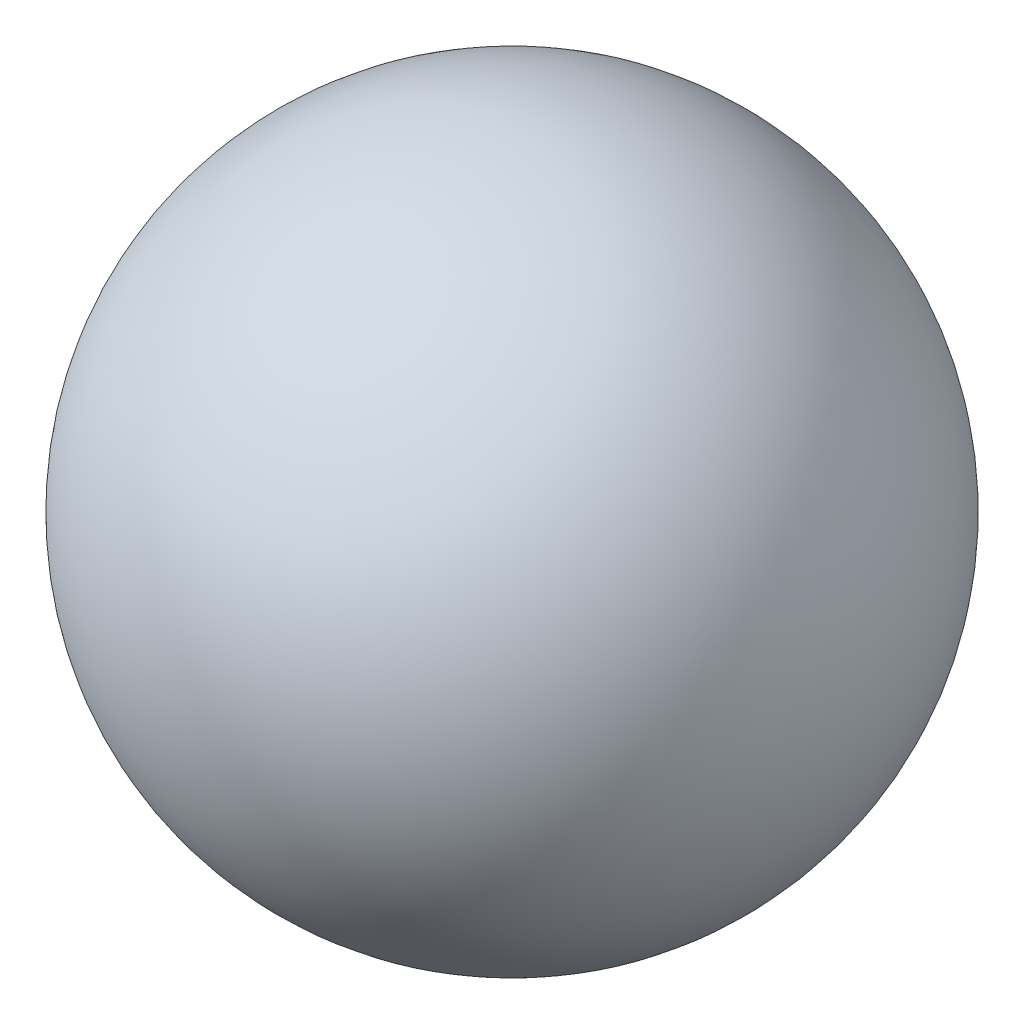
ISO-10303-21;
HEADER;
FILE_DESCRIPTION(('STEP AP214'),'2;1');
FILE_NAME('part.step','',(''),(''),'','','');
FILE_SCHEMA(('AUTOMOTIVE_DESIGN { 1 0 10303 214 1 1 1 1 }'));
ENDSEC;
DATA;
#1=APPLICATION_CONTEXT('core data for automotive mechanical design processes');
#2=APPLICATION_PROTOCOL_DEFINITION('international standard','automotive_design',2000,#1);
#3=PRODUCT_CONTEXT('',#1,'mechanical');
#4=PRODUCT('Part','Part','',(#3));
#5=PRODUCT_RELATED_PRODUCT_CATEGORY('part','',(#4));
#6=PRODUCT_DEFINITION_FORMATION('','',#4);
#7=PRODUCT_DEFINITION_CONTEXT('part definition',#1,'design');
#8=PRODUCT_DEFINITION('design','',#6,#7);
#9=PRODUCT_DEFINITION_SHAPE('','',#8);
#10=(LENGTH_UNIT() NAMED_UNIT(*) SI_UNIT(.MILLI.,.METRE.));
#11=(NAMED_UNIT(*) PLANE_ANGLE_UNIT() SI_UNIT($,.RADIAN.));
#12=(NAMED_UNIT(*) SI_UNIT($,.STERADIAN.) SOLID_ANGLE_UNIT());
#13=UNCERTAINTY_MEASURE_WITH_UNIT(LENGTH_MEASURE(1.E-05),#10,'distance_accuracy_value','');
#14=(GEOMETRIC_REPRESENTATION_CONTEXT(3) GLOBAL_UNCERTAINTY_ASSIGNED_CONTEXT((#13)) GLOBAL_UNIT_ASSIGNED_CONTEXT((#10,
#11,#12)) REPRESENTATION_CONTEXT('',''));
#15=CARTESIAN_POINT('',(0.,0.,0.));
#16=DIRECTION('',(0.,0.,1.));
#17=DIRECTION('',(1.,0.,0.));
#18=AXIS2_PLACEMENT_3D('',#15,#16,#17);
#19=CARTESIAN_POINT('',(-300.,600.,0.));
#20=DIRECTION('',(0.,1.,0.));
#21=DIRECTION('',(-1.,0.,0.));
#22=AXIS2_PLACEMENT_3D('',#19,#20,#21);
#23=SPHERICAL_SURFACE('',#22,1550.36756758);
#24=CARTESIAN_POINT('',(-300.,-805.110199276447,0.));
#25=DIRECTION('',(0.,1.,0.));
#26=DIRECTION('',(-1.,0.,0.));
#27=AXIS2_PLACEMENT_3D('',#24,#25,#26);
#28=CIRCLE('',#27,655.213646449177);
#29=CARTESIAN_POINT('',(-955.213646449177,-805.110199276447,0.));
#30=VERTEX_POINT('',#29);
#31=EDGE_CURVE('E39',#30,#30,#28,.T.);
#32=ORIENTED_EDGE('',*,*,#31,.T.);
#33=EDGE_LOOP('',(#32));
#34=FACE_BOUND('',#33,.T.);
#35=ADVANCED_FACE('F18',(#34),#23,.T.);
#36=CARTESIAN_POINT('',(-595.832783209171,-34.4154509300002,0.));
#37=DIRECTION('',(0.,0.,-1.));
#38=DIRECTION('',(-1.,0.,0.));
#39=AXIS2_PLACEMENT_3D('',#36,#37,#38);
#40=CIRCLE('',#39,850.36756758);
#41=TRIMMED_CURVE('',#40,(PARAMETER_VALUE(-1.92611391201244)),
(PARAMETER_VALUE(1.92611391201244)),.T.,.PARAMETER.);
#42=CARTESIAN_POINT('',(-300.,-34.4154509300001,0.));
#43=DIRECTION('',(0.,1.,0.));
#44=AXIS1_PLACEMENT('',#42,#43);
#45=SURFACE_OF_REVOLUTION('',#41,#44);
#46=CARTESIAN_POINT('',(-300.,-831.665702965483,0.));
#47=VERTEX_POINT('',#46);
#48=VERTEX_LOOP('',#47);
#49=FACE_BOUND('',#48,.T.);
#50=ORIENTED_EDGE('',*,*,#31,.F.);
#51=EDGE_LOOP('',(#50));
#52=FACE_BOUND('',#51,.T.);
#53=ADVANCED_FACE('F33',(#49,#52),#45,.T.);
#54=CLOSED_SHELL('',(#35,#53));
#55=CARTESIAN_POINT('',(56.50784603,143.782535,0.));
#56=DIRECTION('',(0.,0.,-1.));
#57=DIRECTION('',(-1.,0.,0.));
#58=AXIS2_PLACEMENT_3D('',#55,#56,#57);
#59=CIRCLE('',#58,580.6534894);
#60=TRIMMED_CURVE('',#59,(PARAMETER_VALUE(-0.909707150875269)),
(PARAMETER_VALUE(0.909707150875269)),.T.,.PARAMETER.);
#61=CARTESIAN_POINT('',(-300.,143.782535,0.));
#62=DIRECTION('',(0.,1.,0.));
#63=AXIS1_PLACEMENT('',#61,#62);
#64=SURFACE_OF_REVOLUTION('',#60,#63);
#65=CARTESIAN_POINT('',(-300.,324.930025035557,0.));
#66=DIRECTION('',(0.,1.,0.));
#67=DIRECTION('',(-1.,0.,0.));
#68=AXIS2_PLACEMENT_3D('',#65,#66,#67);
#69=CIRCLE('',#68,195.166026476405);
#70=CARTESIAN_POINT('',(-104.833973523595,324.930025035558,-1.3628378681924E-12));
#71=VERTEX_POINT('',#70);
#72=EDGE_CURVE('E11',#71,#71,#69,.T.);
#73=ORIENTED_EDGE('',*,*,#72,.T.);
#74=EDGE_LOOP('',(#73));
#75=FACE_BOUND('',#74,.T.);
#76=CARTESIAN_POINT('',(-300.,-314.541182989202,0.));
#77=VERTEX_POINT('',#76);
#78=VERTEX_LOOP('',#77);
#79=FACE_BOUND('',#78,.T.);
#80=ADVANCED_FACE('F20',(#75,#79),#64,.F.);
#81=CARTESIAN_POINT('',(-300.,600.,0.));
#82=DIRECTION('',(0.,1.,0.));
#83=DIRECTION('',(1.,0.,0.));
#84=AXIS2_PLACEMENT_3D('',#81,#82,#83);
#85=SPHERICAL_SURFACE('',#84,337.27328536);
#86=CARTESIAN_POINT('',(-300.,839.966415884106,0.));
#87=DIRECTION('',(0.,1.,0.));
#88=DIRECTION('',(-1.,0.,0.));
#89=AXIS2_PLACEMENT_3D('',#86,#87,#88);
#90=CIRCLE('',#89,237.000819123615);
#91=CARTESIAN_POINT('',(-62.9991808763856,839.966415884106,-1.65496883307879E-12));
#92=VERTEX_POINT('',#91);
#93=EDGE_CURVE('E27',#92,#92,#90,.T.);
#94=CARTESIAN_POINT('',(-62.9991808763856,839.966415884106,-1.65496883307879E-12));
#95=CARTESIAN_POINT('',(-60.8178165470677,837.812025376089,-1.67020122759945E-12));
#96=CARTESIAN_POINT('',(-58.6658440463807,835.627876009206,-1.68522837995888E-12));
#97=CARTESIAN_POINT('',(-54.4222476197244,831.20171773219,-1.71486127258874E-12));
#98=CARTESIAN_POINT('',(-52.3306236937551,828.959708822058,-1.72946701285918E-12));
#99=CARTESIAN_POINT('',(-48.2092893339902,824.419489633032,-1.75824615354456E-12));
#100=CARTESIAN_POINT('',(-46.1795789001945,822.121279354137,-1.77241955395949E-12));
#101=CARTESIAN_POINT('',(-42.1835783752769,817.470368925249,-1.80032349264696E-12));
#102=CARTESIAN_POINT('',(-40.217288284155,815.117668775256,-1.8140540309195E-12));
#103=CARTESIAN_POINT('',(-36.3495913547304,810.359527533946,-1.8410620298693E-12));
#104=CARTESIAN_POINT('',(-34.4481845164277,807.95408644263,-1.85433949054656E-12));
#105=CARTESIAN_POINT('',(-30.7116678890741,803.092252296942,-1.88043146181239E-12));
#106=CARTESIAN_POINT('',(-28.8765581000233,800.63585924257,-1.89324597240095E-12));
#107=CARTESIAN_POINT('',(-25.2740002972229,795.673947817606,-1.91840251365277E-12));
#108=CARTESIAN_POINT('',(-23.5065522834734,793.168429447013,-1.93074454431604E-12));
#109=CARTESIAN_POINT('',(-20.0406323787416,788.110130627855,-1.95494694767266E-12));
#110=CARTESIAN_POINT('',(-18.3421604877594,785.557350179289,-1.96680732036601E-12));
#111=CARTESIAN_POINT('',(-15.0154558986278,780.406425572895,-1.99003758780657E-12));
#112=CARTESIAN_POINT('',(-13.3872232004784,777.808281415066,-2.00140748255377E-12));
#113=CARTESIAN_POINT('',(-10.2022078293373,772.56856149779,-2.02364833890021E-12));
#114=CARTESIAN_POINT('',(-8.64542515634545,769.926985738342,-2.03451930049944E-12));
#115=CARTESIAN_POINT('',(-5.60446753531234,764.602367022185,-2.05575420637079E-12));
#116=CARTESIAN_POINT('',(-4.12029258727104,761.919324065477,-2.06611815064291E-12));
#117=CARTESIAN_POINT('',(-1.2256541209661,756.513766196495,-2.08633131472597E-12));
#118=CARTESIAN_POINT('',(0.184809397297534,753.791251284221,-2.09618053453691E-12));
#119=CARTESIAN_POINT('',(2.93097611454955,748.308774098994,-2.11535692533715E-12));
#120=CARTESIAN_POINT('',(4.26667931353793,745.548811826041,-2.12468409632644E-12));
#121=CARTESIAN_POINT('',(6.86233209818525,739.993492362046,-2.14280945334407E-12));
#122=CARTESIAN_POINT('',(8.12228168384419,737.198135171004,-2.1516076393724E-12));
#123=CARTESIAN_POINT('',(10.5654902818546,731.574104634805,-2.16866848370774E-12));
#124=CARTESIAN_POINT('',(11.7487492942061,728.745431289648,-2.17693114201476E-12));
#125=CARTESIAN_POINT('',(14.037696816477,723.056871984712,-2.19291478639168E-12));
#126=CARTESIAN_POINT('',(15.1433853263964,720.196986024932,-2.20063577246159E-12));
#127=CARTESIAN_POINT('',(17.2763695998875,714.448128241465,-2.21553033066239E-12));
#128=CARTESIAN_POINT('',(18.3036653634593,711.559156417778,-2.22270390279329E-12));
#129=CARTESIAN_POINT('',(20.2791001970104,705.754275286878,-2.23649829849789E-12));
#130=CARTESIAN_POINT('',(21.2272392669897,702.838365979665,-2.24311912207159E-12));
#131=CARTESIAN_POINT('',(23.0436556308899,696.981778294123,-2.2558030970944E-12));
#132=CARTESIAN_POINT('',(23.9119329248108,694.041099915793,-2.26186624854351E-12));
#133=CARTESIAN_POINT('',(25.5679800432407,688.137160919917,-2.27343037046193E-12));
#134=CARTESIAN_POINT('',(26.3557498677498,685.17390030237,-2.27893134093125E-12));
#135=CARTESIAN_POINT('',(27.8501962232844,679.227000453212,-2.28936701010009E-12));
#136=CARTESIAN_POINT('',(28.55687275431,676.243361221601,-2.29430170879961E-12));
#137=CARTESIAN_POINT('',(29.8886070037351,670.257922923999,-2.30360116474618E-12));
#138=CARTESIAN_POINT('',(30.5136647221345,667.256123858009,-2.30796592199323E-12));
#139=CARTESIAN_POINT('',(31.6816965228955,661.236598175872,-2.31612224918844E-12));
#140=CARTESIAN_POINT('',(32.2246706052569,658.218871559726,-2.3199138191366E-12));
#141=CARTESIAN_POINT('',(33.2281313519259,652.169734906006,-2.32692095213764E-12));
#142=CARTESIAN_POINT('',(33.6886180162335,649.138324868431,-2.33013651519053E-12));
#143=CARTESIAN_POINT('',(34.5267614864472,643.064075676241,-2.33598924315147E-12));
#144=CARTESIAN_POINT('',(34.9044182923532,640.021236521625,-2.33862640805953E-12));
#145=CARTESIAN_POINT('',(35.5766212017394,633.926391898987,-2.34332037860636E-12));
#146=CARTESIAN_POINT('',(35.8711673052196,630.874386430965,-2.34537718424512E-12));
#147=CARTESIAN_POINT('',(36.3769297709025,624.763478801668,-2.34890890671233E-12));
#148=CARTESIAN_POINT('',(36.5881461331052,621.704576640394,-2.35038382354078E-12));
#149=CARTESIAN_POINT('',(36.9270920454425,615.582150373463,-2.35275067156726E-12));
#150=CARTESIAN_POINT('',(37.0548215955771,612.518626267807,-2.3536426027653E-12));
#151=CARTESIAN_POINT('',(37.2266988978534,606.389234298089,-2.3548428162474E-12));
#152=CARTESIAN_POINT('',(37.2708466499951,603.323366434026,-2.35515109853146E-12));
#153=CARTESIAN_POINT('',(37.2755275258636,597.191566876401,-2.35518378493188E-12));
#154=CARTESIAN_POINT('',(37.2360606495904,594.125635182839,-2.35490818904824E-12));
#155=CARTESIAN_POINT('',(37.0735416181236,587.995987942589,-2.35377332405978E-12));
#156=CARTESIAN_POINT('',(36.9504894629299,584.932272395902,-2.35291405495496E-12));
#157=CARTESIAN_POINT('',(36.6208913812076,578.809335777741,-2.35061248251859E-12));
#158=CARTESIAN_POINT('',(36.4143454546791,575.750114706268,-2.34917017918703E-12));
#159=CARTESIAN_POINT('',(35.9179134279141,569.638442024563,-2.34570361086429E-12));
#160=CARTESIAN_POINT('',(35.6280273276776,566.585990414333,-2.3436793458731E-12));
#161=CARTESIAN_POINT('',(34.9651305269424,560.49012660704,-2.3390503595733E-12));
#162=CARTESIAN_POINT('',(34.5921198264438,557.446714409978,-2.33644563826469E-12));
#163=CARTESIAN_POINT('',(33.7632512141381,551.371192658801,-2.33065767632787E-12));
#164=CARTESIAN_POINT('',(33.307393302331,548.339083104686,-2.32747443569966E-12));
#165=CARTESIAN_POINT('',(32.31316926559,542.288421463984,-2.32053180233666E-12));
#166=CARTESIAN_POINT('',(31.774803140656,539.269869377398,-2.31677240960188E-12));
#167=CARTESIAN_POINT('',(30.615963032975,533.248567414341,-2.30868026769357E-12));
#168=CARTESIAN_POINT('',(29.995489050228,530.24581753787,-2.30434751852005E-12));
#169=CARTESIAN_POINT('',(28.6728946416435,524.258352986336,-2.29511188577791E-12));
#170=CARTESIAN_POINT('',(27.970774215806,521.273638311274,-2.2902090022093E-12));
#171=CARTESIAN_POINT('',(26.4854090520409,515.324463741994,-2.27983674670038E-12));
#172=CARTESIAN_POINT('',(25.7021643141134,512.360003847777,-2.27436737476008E-12));
#173=CARTESIAN_POINT('',(24.0551329851649,506.453543357183,-2.26286620979958E-12));
#174=CARTESIAN_POINT('',(23.1913463941439,503.511542760806,-2.25683441677938E-12));
#175=CARTESIAN_POINT('',(21.3838737128562,497.652188681055,-2.24421289519463E-12));
#176=CARTESIAN_POINT('',(20.4401876225894,494.734835197682,-2.23762316663008E-12));
#177=CARTESIAN_POINT('',(18.473617713823,488.926944830309,-2.22389067440024E-12));
#178=CARTESIAN_POINT('',(17.4507338953234,486.03640794631,-2.21674791073497E-12));
#179=CARTESIAN_POINT('',(15.3265291963987,480.284300321921,-2.20191466001119E-12));
#180=CARTESIAN_POINT('',(14.2252083159736,477.422729581531,-2.1942241729527E-12));
#181=CARTESIAN_POINT('',(11.9449484891308,471.730682247964,-2.17830119446385E-12));
#182=CARTESIAN_POINT('',(10.7660095427132,468.900205654785,-2.17006870303348E-12));
#183=CARTESIAN_POINT('',(8.33139030039871,463.272451496114,-2.15306783788313E-12));
#184=CARTESIAN_POINT('',(7.0757100045019,460.475173930621,-2.14429946416313E-12));
#185=CARTESIAN_POINT('',(4.48854184835358,454.915898019381,-2.12623335502397E-12));
#186=CARTESIAN_POINT('',(3.15705398810207,452.153899673633,-2.11693561960479E-12));
#187=CARTESIAN_POINT('',(0.41926086257192,446.667236158591,-2.0978177013169E-12));
#188=CARTESIAN_POINT('',(-0.987044402706725,443.942570989297,-2.08799751844817E-12));
#189=CARTESIAN_POINT('',(-3.87342654109141,438.532600021103,-2.06784200802823E-12));
#190=CARTESIAN_POINT('',(-5.35350341419744,435.847294222203,-2.057506680477E-12));
#191=CARTESIAN_POINT('',(-8.38632811087077,430.518038919186,-2.03632856654581E-12));
#192=CARTESIAN_POINT('',(-9.93907593443807,427.874089415069,-2.02548578016584E-12));
#193=CARTESIAN_POINT('',(-13.1160878330037,422.629512871452,-2.00330081180206E-12));
#194=CARTESIAN_POINT('',(-14.740351908002,420.028885831951,-1.99195862981826E-12));
#195=CARTESIAN_POINT('',(-18.0591884274266,414.8728881707,-1.96878330484663E-12));
#196=CARTESIAN_POINT('',(-19.7537608718529,412.317517548951,-1.95695016185881E-12));
#197=CARTESIAN_POINT('',(-23.2119539633954,407.253933021454,-1.93280171458156E-12));
#198=CARTESIAN_POINT('',(-24.9755746105116,404.745719115708,-1.92048641029213E-12));
#199=CARTESIAN_POINT('',(-28.5705525930892,399.778313250444,-1.89538279867269E-12));
#200=CARTESIAN_POINT('',(-30.4019099285506,397.319121290926,-1.88259449134267E-12));
#201=CARTESIAN_POINT('',(-34.1309994011489,392.451588093208,-1.85655438365134E-12));
#202=CARTESIAN_POINT('',(-36.0287315382858,390.043246855009,-1.84330258329002E-12));
#203=CARTESIAN_POINT('',(-39.889159368096,385.279206060033,-1.81634534422093E-12));
#204=CARTESIAN_POINT('',(-41.8518550607693,382.923506503258,-1.80263990551315E-12));
#205=CARTESIAN_POINT('',(-45.8407504451785,378.266500883963,-1.77478558178541E-12));
#206=CARTESIAN_POINT('',(-47.8669501369144,375.965194821442,-1.76063669676545E-12));
#207=CARTESIAN_POINT('',(-51.9813467392953,371.418687555153,-1.73190600220901E-12));
#208=CARTESIAN_POINT('',(-54.0695436499404,369.173486351383,-1.71732419267254E-12));
#209=CARTESIAN_POINT('',(-58.3063818021267,364.740858439852,-1.6877384928484E-12));
#210=CARTESIAN_POINT('',(-60.4550230436679,362.553431732089,-1.67273460256073E-12));
#211=CARTESIAN_POINT('',(-64.8111520341016,358.23797950429,-1.64231589878284E-12));
#212=CARTESIAN_POINT('',(-67.0186397829941,356.109953984254,-1.62690108529261E-12));
#213=CARTESIAN_POINT('',(-71.4908201518695,351.914886581349,-1.595671998601E-12));
#214=CARTESIAN_POINT('',(-73.7555127718524,349.847844698481,-1.5798577253996E-12));
#215=CARTESIAN_POINT('',(-78.3404188988236,345.776281925172,-1.54784147849047E-12));
#216=CARTESIAN_POINT('',(-80.6606324058119,343.771761034732,-1.53163950478272E-12));
#217=CARTESIAN_POINT('',(-85.3548543162161,339.826730151638,-1.49885990939566E-12));
#218=CARTESIAN_POINT('',(-87.7288627196321,337.886220158985,-1.48228228771634E-12));
#219=CARTESIAN_POINT('',(-92.5289111091068,334.07065694393,-1.4487637095476E-12));
#220=CARTESIAN_POINT('',(-94.9549510951655,332.195603721527,-1.43182275305818E-12));
#221=CARTESIAN_POINT('',(-99.8572506361619,328.512337923913,-1.39759015850105E-12));
#222=CARTESIAN_POINT('',(-102.333510191099,326.704125348702,-1.38029852043335E-12));
#223=CARTESIAN_POINT('',(-104.833973523595,324.930025035558,-1.3628378681924E-12));
#224=B_SPLINE_CURVE_WITH_KNOTS('',3,(#94,#95,#96,#97,#98,#99,#100,#101,#102,#103,#104,#105,#106,
#107,#108,#109,#110,#111,#112,#113,#114,#115,#116,#117,#118,#119,#120,#121,#122,#123,#124,#125,
#126,#127,#128,#129,#130,#131,#132,#133,#134,#135,#136,#137,#138,#139,#140,#141,#142,#143,#144,
#145,#146,#147,#148,#149,#150,#151,#152,#153,#154,#155,#156,#157,#158,#159,#160,#161,#162,#163,
#164,#165,#166,#167,#168,#169,#170,#171,#172,#173,#174,#175,#176,#177,#178,#179,#180,#181,#182,
#183,#184,#185,#186,#187,#188,#189,#190,#191,#192,#193,#194,#195,#196,#197,#198,#199,#200,#201,
#202,#203,#204,#205,#206,#207,#208,#209,#210,#211,#212,#213,#214,#215,#216,#217,#218,#219,#220,
#221,#222,#223),.UNSPECIFIED.,.F.,.F.,(4,2,2,2,2,2,2,2,2,2,2,2,2,2,2,2,2,2,2,2,2,2,2,2,2,2,2,2,
2,2,2,2,2,2,2,2,2,2,2,2,2,2,2,2,2,2,2,2,2,2,2,2,2,2,2,2,2,2,2,2,2,2,2,2,4),(0.,9.19741703547899,
18.394834070958,27.5922511064369,36.7896681419159,45.9870851773948,55.1845022128737,
64.3819192483527,73.5793362838316,82.7767533193106,91.9741703547896,101.171587390268,
110.369004425747,119.566421461226,128.763838496705,137.961255532184,147.158672567663,
156.356089603142,165.553506638621,174.7509236741,183.948340709579,193.145757745058,
202.343174780537,211.540591816016,220.738008851495,229.935425886974,239.132842922453,
248.330259957932,257.527676993411,266.725094028889,275.922511064369,285.119928099848,
294.317345135326,303.514762170805,312.712179206284,321.909596241763,331.107013277242,
340.304430312721,349.5018473482,358.699264383679,367.896681419158,377.094098454637,
386.291515490116,395.488932525595,404.686349561074,413.883766596553,423.081183632032,
432.278600667511,441.47601770299,450.673434738469,459.870851773948,469.068268809427,
478.265685844906,487.463102880384,496.660519915863,505.857936951342,515.055353986822,
524.2527710223,533.450188057779,542.647605093258,551.845022128737,561.042439164216,
570.239856199695,579.437273235174,588.634690270653),.UNSPECIFIED.);
#225=EDGE_CURVE('BSEAM48',#92,#71,#224,.T.);
#226=ORIENTED_EDGE('',*,*,#93,.T.);
#227=ORIENTED_EDGE('',*,*,#72,.F.);
#228=ORIENTED_EDGE('',*,*,#225,.T.);
#229=ORIENTED_EDGE('',*,*,#225,.F.);
#230=EDGE_LOOP('',(#226,#228,#227,#229));
#231=FACE_BOUND('',#230,.T.);
#232=ADVANCED_FACE('F48',(#231),#85,.F.);
#233=CARTESIAN_POINT('',(-300.,950.,0.));
#234=DIRECTION('',(0.,1.,0.));
#235=DIRECTION('',(-1.,0.,0.));
#236=AXIS2_PLACEMENT_3D('',#233,#234,#235);
#237=DEGENERATE_TOROIDAL_SURFACE('',#236,606.217782649107,850.36756759,.F.);
#238=CARTESIAN_POINT('',(-300.,1341.79549406527,0.));
#239=DIRECTION('',(0.,1.,0.));
#240=DIRECTION('',(-1.,0.,0.));
#241=AXIS2_PLACEMENT_3D('',#238,#239,#240);
#242=CIRCLE('',#241,148.5148129363);
#243=CARTESIAN_POINT('',(-448.5148129363,1341.79549406527,0.));
#244=VERTEX_POINT('',#243);
#245=EDGE_CURVE('E41',#244,#244,#242,.T.);
#246=ORIENTED_EDGE('',*,*,#245,.T.);
#247=EDGE_LOOP('',(#246));
#248=FACE_BOUND('',#247,.T.);
#249=ORIENTED_EDGE('',*,*,#93,.F.);
#250=EDGE_LOOP('',(#249));
#251=FACE_BOUND('',#250,.T.);
#252=ADVANCED_FACE('F51',(#248,#251),#237,.T.);
#253=CARTESIAN_POINT('',(-300.,600.,0.));
#254=DIRECTION('',(0.,1.,0.));
#255=DIRECTION('',(1.,0.,0.));
#256=AXIS2_PLACEMENT_3D('',#253,#254,#255);
#257=SPHERICAL_SURFACE('',#256,756.516493327833);
#258=ORIENTED_EDGE('',*,*,#245,.F.);
#259=EDGE_LOOP('',(#258));
#260=FACE_BOUND('',#259,.T.);
#261=ADVANCED_FACE('F53',(#260),#257,.F.);
#262=CLOSED_SHELL('',(#80,#232,#252,#261));
#263=ORIENTED_CLOSED_SHELL('',*,#262,.T.);
#264=BREP_WITH_VOIDS('B1',#54,(#263));
#265=ADVANCED_BREP_SHAPE_REPRESENTATION('',(#18,#264),#14);
#266=SHAPE_DEFINITION_REPRESENTATION(#9,#265);
ENDSEC;
END-ISO-10303-21;
